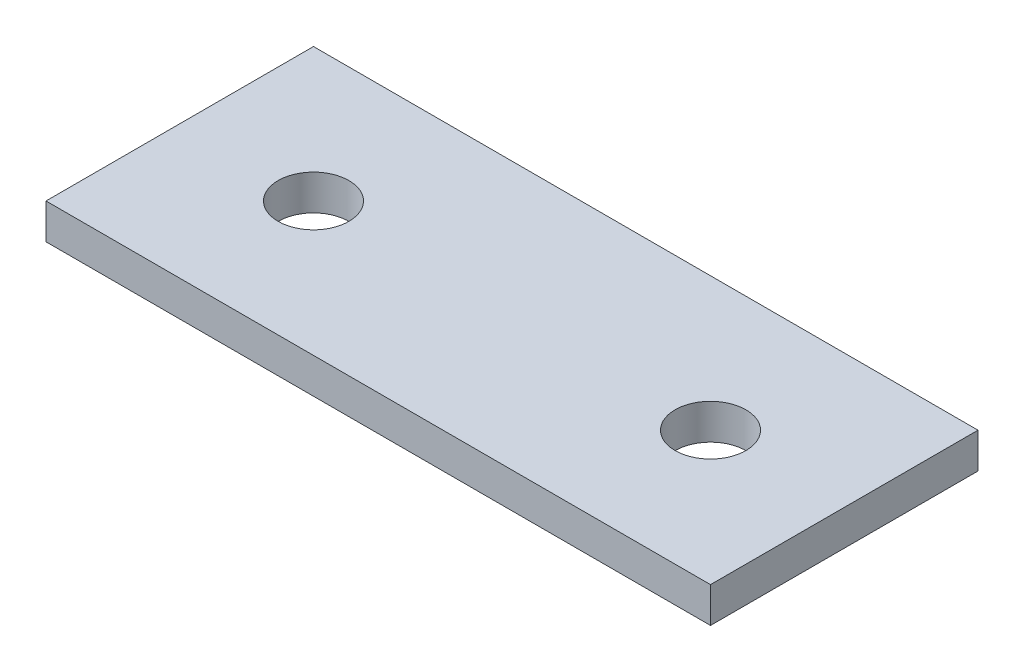
ISO-10303-21;
HEADER;
FILE_DESCRIPTION(('STEP AP214'),'2;1');
FILE_NAME('part.step','',(''),(''),'','','');
FILE_SCHEMA(('AUTOMOTIVE_DESIGN { 1 0 10303 214 1 1 1 1 }'));
ENDSEC;
DATA;
#1=APPLICATION_CONTEXT('core data for automotive mechanical design processes');
#2=APPLICATION_PROTOCOL_DEFINITION('international standard','automotive_design',2000,#1);
#3=PRODUCT_CONTEXT('',#1,'mechanical');
#4=PRODUCT('Part','Part','',(#3));
#5=PRODUCT_RELATED_PRODUCT_CATEGORY('part','',(#4));
#6=PRODUCT_DEFINITION_FORMATION('','',#4);
#7=PRODUCT_DEFINITION_CONTEXT('part definition',#1,'design');
#8=PRODUCT_DEFINITION('design','',#6,#7);
#9=PRODUCT_DEFINITION_SHAPE('','',#8);
#10=(LENGTH_UNIT() NAMED_UNIT(*) SI_UNIT(.MILLI.,.METRE.));
#11=(NAMED_UNIT(*) PLANE_ANGLE_UNIT() SI_UNIT($,.RADIAN.));
#12=(NAMED_UNIT(*) SI_UNIT($,.STERADIAN.) SOLID_ANGLE_UNIT());
#13=UNCERTAINTY_MEASURE_WITH_UNIT(LENGTH_MEASURE(1.E-05),#10,'distance_accuracy_value','');
#14=(GEOMETRIC_REPRESENTATION_CONTEXT(3) GLOBAL_UNCERTAINTY_ASSIGNED_CONTEXT((#13)) GLOBAL_UNIT_ASSIGNED_CONTEXT((#10,
#11,#12)) REPRESENTATION_CONTEXT('',''));
#15=CARTESIAN_POINT('',(0.,0.,0.));
#16=DIRECTION('',(0.,0.,1.));
#17=DIRECTION('',(1.,0.,0.));
#18=AXIS2_PLACEMENT_3D('',#15,#16,#17);
#19=CARTESIAN_POINT('',(0.,0.79375,0.));
#20=DIRECTION('',(0.,1.,0.));
#21=DIRECTION('',(0.,0.,1.));
#22=AXIS2_PLACEMENT_3D('',#19,#20,#21);
#23=PLANE('',#22);
#24=CARTESIAN_POINT('',(-8.905,0.79375,0.));
#25=DIRECTION('',(0.,1.,0.));
#26=DIRECTION('',(0.,0.,1.));
#27=AXIS2_PLACEMENT_3D('',#24,#25,#26);
#28=CIRCLE('',#27,1.5875);
#29=CARTESIAN_POINT('',(-8.905,0.79375,1.5875));
#30=VERTEX_POINT('',#29);
#31=EDGE_CURVE('E99',#30,#30,#28,.T.);
#32=ORIENTED_EDGE('',*,*,#31,.F.);
#33=EDGE_LOOP('',(#32));
#34=FACE_BOUND('',#33,.T.);
#35=DIRECTION('',(0.,0.,1.));
#36=VECTOR('',#35,1.);
#37=CARTESIAN_POINT('',(-14.905,0.79375,6.));
#38=LINE('',#37,#36);
#39=CARTESIAN_POINT('',(-14.905,0.79375,-6.));
#40=VERTEX_POINT('',#39);
#41=CARTESIAN_POINT('',(-14.905,0.79375,6.));
#42=VERTEX_POINT('',#41);
#43=EDGE_CURVE('E84',#40,#42,#38,.T.);
#44=ORIENTED_EDGE('',*,*,#43,.T.);
#45=DIRECTION('',(1.,0.,0.));
#46=VECTOR('',#45,1.);
#47=CARTESIAN_POINT('',(14.905,0.79375,6.));
#48=LINE('',#47,#46);
#49=CARTESIAN_POINT('',(14.905,0.79375,6.));
#50=VERTEX_POINT('',#49);
#51=EDGE_CURVE('E79',#42,#50,#48,.T.);
#52=ORIENTED_EDGE('',*,*,#51,.T.);
#53=DIRECTION('',(0.,0.,-1.));
#54=VECTOR('',#53,1.);
#55=CARTESIAN_POINT('',(14.905,0.79375,6.));
#56=LINE('',#55,#54);
#57=CARTESIAN_POINT('',(14.905,0.79375,-6.));
#58=VERTEX_POINT('',#57);
#59=EDGE_CURVE('E82',#50,#58,#56,.T.);
#60=ORIENTED_EDGE('',*,*,#59,.T.);
#61=DIRECTION('',(-1.,0.,0.));
#62=VECTOR('',#61,1.);
#63=CARTESIAN_POINT('',(14.905,0.79375,-6.));
#64=LINE('',#63,#62);
#65=EDGE_CURVE('E49',#58,#40,#64,.T.);
#66=ORIENTED_EDGE('',*,*,#65,.T.);
#67=EDGE_LOOP('',(#44,#52,#60,#66));
#68=FACE_BOUND('',#67,.T.);
#69=CARTESIAN_POINT('',(8.905,0.79375,0.));
#70=DIRECTION('',(0.,1.,0.));
#71=DIRECTION('',(0.,0.,1.));
#72=AXIS2_PLACEMENT_3D('',#69,#70,#71);
#73=CIRCLE('',#72,1.5875);
#74=CARTESIAN_POINT('',(8.905,0.79375,1.5875));
#75=VERTEX_POINT('',#74);
#76=EDGE_CURVE('E114',#75,#75,#73,.T.);
#77=ORIENTED_EDGE('',*,*,#76,.F.);
#78=EDGE_LOOP('',(#77));
#79=FACE_BOUND('',#78,.T.);
#80=ADVANCED_FACE('F32',(#34,#68,#79),#23,.T.);
#81=CARTESIAN_POINT('',(0.,-0.79375,0.));
#82=DIRECTION('',(0.,1.,0.));
#83=DIRECTION('',(0.,0.,1.));
#84=AXIS2_PLACEMENT_3D('',#81,#82,#83);
#85=PLANE('',#84);
#86=CARTESIAN_POINT('',(-8.905,-0.79375,0.));
#87=DIRECTION('',(0.,1.,0.));
#88=DIRECTION('',(0.,0.,1.));
#89=AXIS2_PLACEMENT_3D('',#86,#87,#88);
#90=CIRCLE('',#89,1.5875);
#91=CARTESIAN_POINT('',(-8.905,-0.79375,1.5875));
#92=VERTEX_POINT('',#91);
#93=EDGE_CURVE('E111',#92,#92,#90,.T.);
#94=ORIENTED_EDGE('',*,*,#93,.T.);
#95=EDGE_LOOP('',(#94));
#96=FACE_BOUND('',#95,.T.);
#97=DIRECTION('',(0.,0.,1.));
#98=VECTOR('',#97,1.);
#99=CARTESIAN_POINT('',(-14.905,-0.79375,6.));
#100=LINE('',#99,#98);
#101=CARTESIAN_POINT('',(-14.905,-0.79375,-6.));
#102=VERTEX_POINT('',#101);
#103=CARTESIAN_POINT('',(-14.905,-0.79375,6.));
#104=VERTEX_POINT('',#103);
#105=EDGE_CURVE('E96',#102,#104,#100,.T.);
#106=ORIENTED_EDGE('',*,*,#105,.F.);
#107=DIRECTION('',(-1.,0.,0.));
#108=VECTOR('',#107,1.);
#109=CARTESIAN_POINT('',(14.905,-0.79375,-6.));
#110=LINE('',#109,#108);
#111=CARTESIAN_POINT('',(14.905,-0.79375,-6.));
#112=VERTEX_POINT('',#111);
#113=EDGE_CURVE('E72',#112,#102,#110,.T.);
#114=ORIENTED_EDGE('',*,*,#113,.F.);
#115=DIRECTION('',(0.,0.,-1.));
#116=VECTOR('',#115,1.);
#117=CARTESIAN_POINT('',(14.905,-0.79375,6.));
#118=LINE('',#117,#116);
#119=CARTESIAN_POINT('',(14.905,-0.79375,6.));
#120=VERTEX_POINT('',#119);
#121=EDGE_CURVE('E66',#120,#112,#118,.T.);
#122=ORIENTED_EDGE('',*,*,#121,.F.);
#123=DIRECTION('',(1.,0.,0.));
#124=VECTOR('',#123,1.);
#125=CARTESIAN_POINT('',(14.905,-0.79375,6.));
#126=LINE('',#125,#124);
#127=EDGE_CURVE('E88',#104,#120,#126,.T.);
#128=ORIENTED_EDGE('',*,*,#127,.F.);
#129=EDGE_LOOP('',(#106,#114,#122,#128));
#130=FACE_BOUND('',#129,.T.);
#131=CARTESIAN_POINT('',(8.905,-0.79375,0.));
#132=DIRECTION('',(0.,1.,0.));
#133=DIRECTION('',(0.,0.,1.));
#134=AXIS2_PLACEMENT_3D('',#131,#132,#133);
#135=CIRCLE('',#134,1.5875);
#136=CARTESIAN_POINT('',(8.905,-0.79375,1.5875));
#137=VERTEX_POINT('',#136);
#138=EDGE_CURVE('E117',#137,#137,#135,.T.);
#139=ORIENTED_EDGE('',*,*,#138,.T.);
#140=EDGE_LOOP('',(#139));
#141=FACE_BOUND('',#140,.T.);
#142=ADVANCED_FACE('F107',(#96,#130,#141),#85,.F.);
#143=CARTESIAN_POINT('',(-14.905,0.79375,6.));
#144=DIRECTION('',(1.,0.,0.));
#145=DIRECTION('',(0.,0.,-1.));
#146=AXIS2_PLACEMENT_3D('',#143,#144,#145);
#147=PLANE('',#146);
#148=ORIENTED_EDGE('',*,*,#105,.T.);
#149=DIRECTION('',(0.,-1.,0.));
#150=VECTOR('',#149,1.);
#151=CARTESIAN_POINT('',(-14.905,0.79375,6.));
#152=LINE('',#151,#150);
#153=EDGE_CURVE('E11',#42,#104,#152,.T.);
#154=ORIENTED_EDGE('',*,*,#153,.F.);
#155=ORIENTED_EDGE('',*,*,#43,.F.);
#156=DIRECTION('',(0.,-1.,0.));
#157=VECTOR('',#156,1.);
#158=CARTESIAN_POINT('',(-14.905,0.79375,-6.));
#159=LINE('',#158,#157);
#160=EDGE_CURVE('E92',#40,#102,#159,.T.);
#161=ORIENTED_EDGE('',*,*,#160,.T.);
#162=EDGE_LOOP('',(#148,#154,#155,#161));
#163=FACE_BOUND('',#162,.T.);
#164=ADVANCED_FACE('F34',(#163),#147,.F.);
#165=CARTESIAN_POINT('',(14.905,0.79375,6.));
#166=DIRECTION('',(0.,0.,-1.));
#167=DIRECTION('',(-1.,0.,0.));
#168=AXIS2_PLACEMENT_3D('',#165,#166,#167);
#169=PLANE('',#168);
#170=ORIENTED_EDGE('',*,*,#127,.T.);
#171=DIRECTION('',(0.,-1.,0.));
#172=VECTOR('',#171,1.);
#173=CARTESIAN_POINT('',(14.905,0.79375,6.));
#174=LINE('',#173,#172);
#175=EDGE_CURVE('E41',#50,#120,#174,.T.);
#176=ORIENTED_EDGE('',*,*,#175,.F.);
#177=ORIENTED_EDGE('',*,*,#51,.F.);
#178=ORIENTED_EDGE('',*,*,#153,.T.);
#179=EDGE_LOOP('',(#170,#176,#177,#178));
#180=FACE_BOUND('',#179,.T.);
#181=ADVANCED_FACE('F87',(#180),#169,.F.);
#182=CARTESIAN_POINT('',(14.905,0.79375,6.));
#183=DIRECTION('',(-1.,0.,0.));
#184=DIRECTION('',(0.,0.,1.));
#185=AXIS2_PLACEMENT_3D('',#182,#183,#184);
#186=PLANE('',#185);
#187=ORIENTED_EDGE('',*,*,#121,.T.);
#188=DIRECTION('',(0.,-1.,0.));
#189=VECTOR('',#188,1.);
#190=CARTESIAN_POINT('',(14.905,0.79375,-6.));
#191=LINE('',#190,#189);
#192=EDGE_CURVE('E89',#58,#112,#191,.T.);
#193=ORIENTED_EDGE('',*,*,#192,.F.);
#194=ORIENTED_EDGE('',*,*,#59,.F.);
#195=ORIENTED_EDGE('',*,*,#175,.T.);
#196=EDGE_LOOP('',(#187,#193,#194,#195));
#197=FACE_BOUND('',#196,.T.);
#198=ADVANCED_FACE('F90',(#197),#186,.F.);
#199=CARTESIAN_POINT('',(14.905,0.79375,-6.));
#200=DIRECTION('',(0.,0.,1.));
#201=DIRECTION('',(1.,0.,0.));
#202=AXIS2_PLACEMENT_3D('',#199,#200,#201);
#203=PLANE('',#202);
#204=ORIENTED_EDGE('',*,*,#113,.T.);
#205=ORIENTED_EDGE('',*,*,#160,.F.);
#206=ORIENTED_EDGE('',*,*,#65,.F.);
#207=ORIENTED_EDGE('',*,*,#192,.T.);
#208=EDGE_LOOP('',(#204,#205,#206,#207));
#209=FACE_BOUND('',#208,.T.);
#210=ADVANCED_FACE('F104',(#209),#203,.F.);
#211=CARTESIAN_POINT('',(-8.905,0.79375,0.));
#212=DIRECTION('',(0.,-1.,0.));
#213=DIRECTION('',(0.,0.,-1.));
#214=AXIS2_PLACEMENT_3D('',#211,#212,#213);
#215=CYLINDRICAL_SURFACE('',#214,1.5875);
#216=ORIENTED_EDGE('',*,*,#31,.T.);
#217=EDGE_LOOP('',(#216));
#218=FACE_BOUND('',#217,.T.);
#219=ORIENTED_EDGE('',*,*,#93,.F.);
#220=EDGE_LOOP('',(#219));
#221=FACE_BOUND('',#220,.T.);
#222=ADVANCED_FACE('F135',(#218,#221),#215,.F.);
#223=CARTESIAN_POINT('',(8.905,0.79375,0.));
#224=DIRECTION('',(0.,-1.,0.));
#225=DIRECTION('',(0.,0.,-1.));
#226=AXIS2_PLACEMENT_3D('',#223,#224,#225);
#227=CYLINDRICAL_SURFACE('',#226,1.5875);
#228=ORIENTED_EDGE('',*,*,#76,.T.);
#229=EDGE_LOOP('',(#228));
#230=FACE_BOUND('',#229,.T.);
#231=ORIENTED_EDGE('',*,*,#138,.F.);
#232=EDGE_LOOP('',(#231));
#233=FACE_BOUND('',#232,.T.);
#234=ADVANCED_FACE('F123',(#230,#233),#227,.F.);
#235=CLOSED_SHELL('',(#80,#142,#164,#181,#198,#210,#222,#234));
#236=MANIFOLD_SOLID_BREP('B2',#235);
#237=ADVANCED_BREP_SHAPE_REPRESENTATION('',(#18,#236),#14);
#238=SHAPE_DEFINITION_REPRESENTATION(#9,#237);
ENDSEC;
END-ISO-10303-21;
